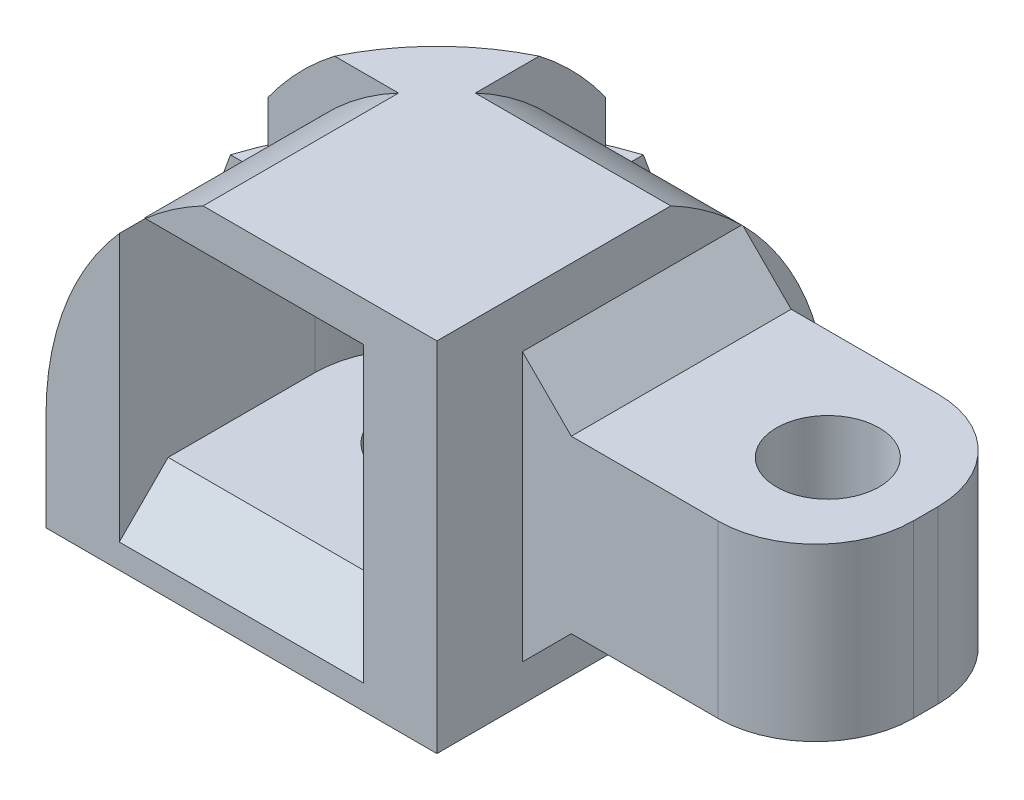
ISO-10303-21;
HEADER;
FILE_DESCRIPTION(('STEP AP214'),'2;1');
FILE_NAME('part.step','',(''),(''),'','','');
FILE_SCHEMA(('AUTOMOTIVE_DESIGN { 1 0 10303 214 1 1 1 1 }'));
ENDSEC;
DATA;
#1=APPLICATION_CONTEXT('core data for automotive mechanical design processes');
#2=APPLICATION_PROTOCOL_DEFINITION('international standard','automotive_design',2000,#1);
#3=PRODUCT_CONTEXT('',#1,'mechanical');
#4=PRODUCT('Part','Part','',(#3));
#5=PRODUCT_RELATED_PRODUCT_CATEGORY('part','',(#4));
#6=PRODUCT_DEFINITION_FORMATION('','',#4);
#7=PRODUCT_DEFINITION_CONTEXT('part definition',#1,'design');
#8=PRODUCT_DEFINITION('design','',#6,#7);
#9=PRODUCT_DEFINITION_SHAPE('','',#8);
#10=(LENGTH_UNIT() NAMED_UNIT(*) SI_UNIT(.MILLI.,.METRE.));
#11=(NAMED_UNIT(*) PLANE_ANGLE_UNIT() SI_UNIT($,.RADIAN.));
#12=(NAMED_UNIT(*) SI_UNIT($,.STERADIAN.) SOLID_ANGLE_UNIT());
#13=UNCERTAINTY_MEASURE_WITH_UNIT(LENGTH_MEASURE(1.E-05),#10,'distance_accuracy_value','');
#14=(GEOMETRIC_REPRESENTATION_CONTEXT(3) GLOBAL_UNCERTAINTY_ASSIGNED_CONTEXT((#13)) GLOBAL_UNIT_ASSIGNED_CONTEXT((#10,
#11,#12)) REPRESENTATION_CONTEXT('',''));
#15=CARTESIAN_POINT('',(0.,0.,0.));
#16=DIRECTION('',(0.,0.,1.));
#17=DIRECTION('',(1.,0.,0.));
#18=AXIS2_PLACEMENT_3D('',#15,#16,#17);
#19=CARTESIAN_POINT('',(0.,0.,0.));
#20=DIRECTION('',(0.,-1.,0.));
#21=DIRECTION('',(-1.,0.,0.));
#22=AXIS2_PLACEMENT_3D('',#19,#20,#21);
#23=SPHERICAL_SURFACE('',#22,7.);
#24=CARTESIAN_POINT('',(0.,0.,-2.));
#25=DIRECTION('',(0.,0.,1.));
#26=DIRECTION('',(1.,0.,0.));
#27=AXIS2_PLACEMENT_3D('',#24,#25,#26);
#28=CIRCLE('',#27,6.70820393249937);
#29=CARTESIAN_POINT('',(-6.40312423743285,-2.,-2.));
#30=VERTEX_POINT('',#29);
#31=CARTESIAN_POINT('',(-6.22494979899437,2.5,-2.));
#32=VERTEX_POINT('',#31);
#33=EDGE_CURVE('E251',#30,#32,#28,.F.);
#34=ORIENTED_EDGE('',*,*,#33,.T.);
#35=CARTESIAN_POINT('',(0.,2.5,0.));
#36=DIRECTION('',(0.,-1.,0.));
#37=DIRECTION('',(0.,0.,1.));
#38=AXIS2_PLACEMENT_3D('',#35,#36,#37);
#39=CIRCLE('',#38,6.53834841531101);
#40=CARTESIAN_POINT('',(-2.,2.5,-6.22494979899437));
#41=VERTEX_POINT('',#40);
#42=EDGE_CURVE('E55',#32,#41,#39,.T.);
#43=ORIENTED_EDGE('',*,*,#42,.T.);
#44=CARTESIAN_POINT('',(-2.,0.,0.));
#45=DIRECTION('',(1.,0.,0.));
#46=DIRECTION('',(0.,0.,-1.));
#47=AXIS2_PLACEMENT_3D('',#44,#45,#46);
#48=CIRCLE('',#47,6.70820393249937);
#49=CARTESIAN_POINT('',(-2.,-2.,-6.40312423743285));
#50=VERTEX_POINT('',#49);
#51=EDGE_CURVE('E249',#41,#50,#48,.F.);
#52=ORIENTED_EDGE('',*,*,#51,.T.);
#53=CARTESIAN_POINT('',(0.,-2.,0.));
#54=DIRECTION('',(0.,-1.,0.));
#55=DIRECTION('',(0.,0.,-1.));
#56=AXIS2_PLACEMENT_3D('',#53,#54,#55);
#57=CIRCLE('',#56,6.70820393249937);
#58=EDGE_CURVE('E540',#50,#30,#57,.F.);
#59=ORIENTED_EDGE('',*,*,#58,.T.);
#60=EDGE_LOOP('',(#34,#43,#52,#59));
#61=FACE_BOUND('',#60,.T.);
#62=ADVANCED_FACE('F39',(#61),#23,.T.);
#63=CARTESIAN_POINT('',(-2.,0.,0.));
#64=DIRECTION('',(1.,0.,0.));
#65=DIRECTION('',(0.,0.,-1.));
#66=AXIS2_PLACEMENT_3D('',#63,#64,#65);
#67=PLANE('',#66);
#68=ORIENTED_EDGE('',*,*,#51,.F.);
#69=DIRECTION('',(0.,0.,1.));
#70=VECTOR('',#69,1.);
#71=CARTESIAN_POINT('',(-2.,2.5,-6.22494979899437));
#72=LINE('',#71,#70);
#73=CARTESIAN_POINT('',(-2.,2.5,-5.45435605731786));
#74=VERTEX_POINT('',#73);
#75=EDGE_CURVE('E238',#41,#74,#72,.T.);
#76=ORIENTED_EDGE('',*,*,#75,.T.);
#77=CARTESIAN_POINT('',(-2.,0.,0.));
#78=DIRECTION('',(-1.,0.,0.));
#79=DIRECTION('',(0.,0.,-1.));
#80=AXIS2_PLACEMENT_3D('',#77,#78,#79);
#81=CIRCLE('',#80,6.);
#82=CARTESIAN_POINT('',(-2.,0.,-6.));
#83=VERTEX_POINT('',#82);
#84=EDGE_CURVE('E459',#74,#83,#81,.T.);
#85=ORIENTED_EDGE('',*,*,#84,.T.);
#86=DIRECTION('',(0.,-1.,0.));
#87=VECTOR('',#86,1.);
#88=CARTESIAN_POINT('',(-2.,-2.,-6.));
#89=LINE('',#88,#87);
#90=CARTESIAN_POINT('',(-2.,-2.,-6.));
#91=VERTEX_POINT('',#90);
#92=EDGE_CURVE('E473',#83,#91,#89,.T.);
#93=ORIENTED_EDGE('',*,*,#92,.T.);
#94=DIRECTION('',(0.,0.,-1.));
#95=VECTOR('',#94,1.);
#96=CARTESIAN_POINT('',(-2.,-2.,-7.));
#97=LINE('',#96,#95);
#98=EDGE_CURVE('E257',#91,#50,#97,.T.);
#99=ORIENTED_EDGE('',*,*,#98,.T.);
#100=EDGE_LOOP('',(#68,#76,#85,#93,#99));
#101=FACE_BOUND('',#100,.T.);
#102=ADVANCED_FACE('F255',(#101),#67,.T.);
#103=CARTESIAN_POINT('',(0.,0.,-2.));
#104=DIRECTION('',(0.,0.,1.));
#105=DIRECTION('',(-1.,0.,0.));
#106=AXIS2_PLACEMENT_3D('',#103,#104,#105);
#107=PLANE('',#106);
#108=CARTESIAN_POINT('',(0.,0.,-2.));
#109=DIRECTION('',(0.,0.,1.));
#110=DIRECTION('',(-1.,0.,0.));
#111=AXIS2_PLACEMENT_3D('',#108,#109,#110);
#112=CIRCLE('',#111,6.);
#113=CARTESIAN_POINT('',(-5.45435605731786,2.5,-2.));
#114=VERTEX_POINT('',#113);
#115=CARTESIAN_POINT('',(-6.,0.,-2.));
#116=VERTEX_POINT('',#115);
#117=EDGE_CURVE('E439',#114,#116,#112,.T.);
#118=ORIENTED_EDGE('',*,*,#117,.F.);
#119=DIRECTION('',(-1.,0.,0.));
#120=VECTOR('',#119,1.);
#121=CARTESIAN_POINT('',(-5.45435605731786,2.5,-2.));
#122=LINE('',#121,#120);
#123=EDGE_CURVE('E597',#114,#32,#122,.T.);
#124=ORIENTED_EDGE('',*,*,#123,.T.);
#125=ORIENTED_EDGE('',*,*,#33,.F.);
#126=DIRECTION('',(-1.,0.,0.));
#127=VECTOR('',#126,1.);
#128=CARTESIAN_POINT('',(-7.,-2.,-2.));
#129=LINE('',#128,#127);
#130=CARTESIAN_POINT('',(-6.,-2.,-2.));
#131=VERTEX_POINT('',#130);
#132=EDGE_CURVE('E501',#131,#30,#129,.T.);
#133=ORIENTED_EDGE('',*,*,#132,.F.);
#134=DIRECTION('',(0.,-1.,0.));
#135=VECTOR('',#134,1.);
#136=CARTESIAN_POINT('',(-6.,-2.,-2.));
#137=LINE('',#136,#135);
#138=EDGE_CURVE('E446',#116,#131,#137,.T.);
#139=ORIENTED_EDGE('',*,*,#138,.F.);
#140=EDGE_LOOP('',(#118,#124,#125,#133,#139));
#141=FACE_BOUND('',#140,.T.);
#142=ADVANCED_FACE('F605',(#141),#107,.T.);
#143=CARTESIAN_POINT('',(2.,0.,0.));
#144=DIRECTION('',(1.,0.,0.));
#145=DIRECTION('',(0.,0.,-1.));
#146=AXIS2_PLACEMENT_3D('',#143,#144,#145);
#147=PLANE('',#146);
#148=DIRECTION('',(0.,0.,-1.));
#149=VECTOR('',#148,1.);
#150=CARTESIAN_POINT('',(2.,5.31428571428571,2.));
#151=LINE('',#150,#149);
#152=CARTESIAN_POINT('',(2.,5.31428571428571,2.));
#153=VERTEX_POINT('',#152);
#154=CARTESIAN_POINT('',(2.,5.31428571428571,-2.78538459587519));
#155=VERTEX_POINT('',#154);
#156=EDGE_CURVE('E588',#153,#155,#151,.T.);
#157=ORIENTED_EDGE('',*,*,#156,.F.);
#158=DIRECTION('',(0.,-1.,0.));
#159=VECTOR('',#158,1.);
#160=CARTESIAN_POINT('',(2.,-2.,2.));
#161=LINE('',#160,#159);
#162=CARTESIAN_POINT('',(2.,-2.,2.));
#163=VERTEX_POINT('',#162);
#164=EDGE_CURVE('E265',#153,#163,#161,.T.);
#165=ORIENTED_EDGE('',*,*,#164,.T.);
#166=DIRECTION('',(0.,0.,-1.));
#167=VECTOR('',#166,1.);
#168=CARTESIAN_POINT('',(2.,-2.,-7.));
#169=LINE('',#168,#167);
#170=CARTESIAN_POINT('',(2.,-2.,-6.));
#171=VERTEX_POINT('',#170);
#172=EDGE_CURVE('E272',#163,#171,#169,.T.);
#173=ORIENTED_EDGE('',*,*,#172,.T.);
#174=DIRECTION('',(0.,-1.,0.));
#175=VECTOR('',#174,1.);
#176=CARTESIAN_POINT('',(2.,-2.,-6.));
#177=LINE('',#176,#175);
#178=CARTESIAN_POINT('',(2.,0.,-6.));
#179=VERTEX_POINT('',#178);
#180=EDGE_CURVE('E464',#179,#171,#177,.T.);
#181=ORIENTED_EDGE('',*,*,#180,.F.);
#182=CARTESIAN_POINT('',(2.,0.,0.));
#183=DIRECTION('',(-1.,0.,0.));
#184=DIRECTION('',(0.,0.,-1.));
#185=AXIS2_PLACEMENT_3D('',#182,#183,#184);
#186=CIRCLE('',#185,6.);
#187=CARTESIAN_POINT('',(2.,4.23526858652436,-4.25));
#188=VERTEX_POINT('',#187);
#189=EDGE_CURVE('E465',#188,#179,#186,.T.);
#190=ORIENTED_EDGE('',*,*,#189,.F.);
#191=DIRECTION('',(0.,1.,0.));
#192=VECTOR('',#191,1.);
#193=CARTESIAN_POINT('',(2.,-0.25,-4.25));
#194=LINE('',#193,#192);
#195=CARTESIAN_POINT('',(2.,-1.25,-4.25));
#196=VERTEX_POINT('',#195);
#197=EDGE_CURVE('E557',#196,#188,#194,.T.);
#198=ORIENTED_EDGE('',*,*,#197,.F.);
#199=DIRECTION('',(0.,0.,1.));
#200=VECTOR('',#199,1.);
#201=CARTESIAN_POINT('',(2.,-1.25,0.));
#202=LINE('',#201,#200);
#203=CARTESIAN_POINT('',(2.,-1.25,0.25));
#204=VERTEX_POINT('',#203);
#205=EDGE_CURVE('E313',#196,#204,#202,.T.);
#206=ORIENTED_EDGE('',*,*,#205,.T.);
#207=DIRECTION('',(0.,-1.,0.));
#208=VECTOR('',#207,1.);
#209=CARTESIAN_POINT('',(2.,-0.250000000000001,0.25));
#210=LINE('',#209,#208);
#211=CARTESIAN_POINT('',(2.,4.24999999999999,0.25));
#212=VERTEX_POINT('',#211);
#213=EDGE_CURVE('E561',#212,#204,#210,.T.);
#214=ORIENTED_EDGE('',*,*,#213,.F.);
#215=DIRECTION('',(0.,0.,-1.));
#216=VECTOR('',#215,1.);
#217=CARTESIAN_POINT('',(2.,4.24999999999999,0.));
#218=LINE('',#217,#216);
#219=CARTESIAN_POINT('',(2.,4.25,-4.23526858652436));
#220=VERTEX_POINT('',#219);
#221=EDGE_CURVE('E317',#212,#220,#218,.T.);
#222=ORIENTED_EDGE('',*,*,#221,.T.);
#223=EDGE_CURVE('E460',#155,#220,#186,.T.);
#224=ORIENTED_EDGE('',*,*,#223,.F.);
#225=EDGE_LOOP('',(#157,#165,#173,#181,#190,#198,#206,#214,#222,#224));
#226=FACE_BOUND('',#225,.T.);
#227=ADVANCED_FACE('F617',(#226),#147,.T.);
#228=CARTESIAN_POINT('',(0.,-2.,0.));
#229=DIRECTION('',(0.,-1.,0.));
#230=DIRECTION('',(0.,0.,-1.));
#231=AXIS2_PLACEMENT_3D('',#228,#229,#230);
#232=PLANE('',#231);
#233=CARTESIAN_POINT('',(-2.,-2.,-2.));
#234=DIRECTION('',(0.,-1.,0.));
#235=DIRECTION('',(0.,0.,-1.));
#236=AXIS2_PLACEMENT_3D('',#233,#234,#235);
#237=CIRCLE('',#236,1.1);
#238=CARTESIAN_POINT('',(-2.,-2.,-3.1));
#239=VERTEX_POINT('',#238);
#240=EDGE_CURVE('E286',#239,#239,#237,.T.);
#241=ORIENTED_EDGE('',*,*,#240,.F.);
#242=EDGE_LOOP('',(#241));
#243=FACE_BOUND('',#242,.T.);
#244=ORIENTED_EDGE('',*,*,#58,.F.);
#245=ORIENTED_EDGE('',*,*,#98,.F.);
#246=DIRECTION('',(-1.,0.,0.));
#247=VECTOR('',#246,1.);
#248=CARTESIAN_POINT('',(2.,-2.,-6.));
#249=LINE('',#248,#247);
#250=EDGE_CURVE('E468',#171,#91,#249,.T.);
#251=ORIENTED_EDGE('',*,*,#250,.F.);
#252=ORIENTED_EDGE('',*,*,#172,.F.);
#253=DIRECTION('',(1.,0.,0.));
#254=VECTOR('',#253,1.);
#255=CARTESIAN_POINT('',(-7.,-2.,2.));
#256=LINE('',#255,#254);
#257=CARTESIAN_POINT('',(-6.,-2.,2.));
#258=VERTEX_POINT('',#257);
#259=EDGE_CURVE('E276',#258,#163,#256,.T.);
#260=ORIENTED_EDGE('',*,*,#259,.F.);
#261=DIRECTION('',(0.,0.,-1.));
#262=VECTOR('',#261,1.);
#263=CARTESIAN_POINT('',(-6.,-2.,2.));
#264=LINE('',#263,#262);
#265=EDGE_CURVE('E453',#258,#131,#264,.T.);
#266=ORIENTED_EDGE('',*,*,#265,.T.);
#267=ORIENTED_EDGE('',*,*,#132,.T.);
#268=EDGE_LOOP('',(#244,#245,#251,#252,#260,#266,#267));
#269=FACE_BOUND('',#268,.T.);
#270=ADVANCED_FACE('F614',(#243,#269),#232,.T.);
#271=CARTESIAN_POINT('',(0.,0.,2.));
#272=DIRECTION('',(0.,0.,1.));
#273=DIRECTION('',(1.,0.,0.));
#274=AXIS2_PLACEMENT_3D('',#271,#272,#273);
#275=PLANE('',#274);
#276=DIRECTION('',(1.,0.,0.));
#277=VECTOR('',#276,1.);
#278=CARTESIAN_POINT('',(-8.,5.31428571428571,2.));
#279=LINE('',#278,#277);
#280=CARTESIAN_POINT('',(-2.78538459587519,5.31428571428571,2.));
#281=VERTEX_POINT('',#280);
#282=EDGE_CURVE('E585',#281,#153,#279,.T.);
#283=ORIENTED_EDGE('',*,*,#282,.F.);
#284=CARTESIAN_POINT('',(0.,0.,2.));
#285=DIRECTION('',(0.,0.,1.));
#286=DIRECTION('',(-1.,0.,0.));
#287=AXIS2_PLACEMENT_3D('',#284,#285,#286);
#288=CIRCLE('',#287,6.);
#289=CARTESIAN_POINT('',(-3.96862696659688,4.5,2.));
#290=VERTEX_POINT('',#289);
#291=EDGE_CURVE('E430',#281,#290,#288,.T.);
#292=ORIENTED_EDGE('',*,*,#291,.T.);
#293=DIRECTION('',(1.,0.,0.));
#294=VECTOR('',#293,1.);
#295=CARTESIAN_POINT('',(0.5,4.5,2.));
#296=LINE('',#295,#294);
#297=CARTESIAN_POINT('',(0.5,4.5,2.));
#298=VERTEX_POINT('',#297);
#299=EDGE_CURVE('E294',#290,#298,#296,.T.);
#300=ORIENTED_EDGE('',*,*,#299,.T.);
#301=DIRECTION('',(0.,1.,0.));
#302=VECTOR('',#301,1.);
#303=CARTESIAN_POINT('',(0.5,-0.500000000000001,2.));
#304=LINE('',#303,#302);
#305=CARTESIAN_POINT('',(0.5,-1.50000000000001,2.));
#306=VERTEX_POINT('',#305);
#307=EDGE_CURVE('E538',#306,#298,#304,.T.);
#308=ORIENTED_EDGE('',*,*,#307,.F.);
#309=DIRECTION('',(-1.,0.,0.));
#310=VECTOR('',#309,1.);
#311=CARTESIAN_POINT('',(-4.5,-1.50000000000001,2.));
#312=LINE('',#311,#310);
#313=CARTESIAN_POINT('',(-4.5,-1.50000000000001,2.));
#314=VERTEX_POINT('',#313);
#315=EDGE_CURVE('E290',#306,#314,#312,.T.);
#316=ORIENTED_EDGE('',*,*,#315,.T.);
#317=DIRECTION('',(0.,-1.,0.));
#318=VECTOR('',#317,1.);
#319=CARTESIAN_POINT('',(-4.5,-0.500000000000002,2.));
#320=LINE('',#319,#318);
#321=CARTESIAN_POINT('',(-4.5,3.96862696659689,2.));
#322=VERTEX_POINT('',#321);
#323=EDGE_CURVE('E518',#322,#314,#320,.T.);
#324=ORIENTED_EDGE('',*,*,#323,.F.);
#325=CARTESIAN_POINT('',(-6.,0.,2.));
#326=VERTEX_POINT('',#325);
#327=EDGE_CURVE('E444',#322,#326,#288,.T.);
#328=ORIENTED_EDGE('',*,*,#327,.T.);
#329=DIRECTION('',(0.,-1.,0.));
#330=VECTOR('',#329,1.);
#331=CARTESIAN_POINT('',(-6.,-2.,2.));
#332=LINE('',#331,#330);
#333=EDGE_CURVE('E438',#326,#258,#332,.T.);
#334=ORIENTED_EDGE('',*,*,#333,.T.);
#335=ORIENTED_EDGE('',*,*,#259,.T.);
#336=ORIENTED_EDGE('',*,*,#164,.F.);
#337=EDGE_LOOP('',(#283,#292,#300,#308,#316,#324,#328,#334,#335,#336));
#338=FACE_BOUND('',#337,.T.);
#339=ADVANCED_FACE('F611',(#338),#275,.T.);
#340=CARTESIAN_POINT('',(0.,3.90512483795333,0.));
#341=DIRECTION('',(0.,-1.,0.));
#342=DIRECTION('',(0.,0.,-1.));
#343=AXIS2_PLACEMENT_3D('',#340,#341,#342);
#344=CIRCLE('',#343,5.80947501931113);
#345=CARTESIAN_POINT('',(-5.45435605731786,3.90512483795332,-2.));
#346=VERTEX_POINT('',#345);
#347=CARTESIAN_POINT('',(-2.,3.90512483795332,-5.45435605731786));
#348=VERTEX_POINT('',#347);
#349=EDGE_CURVE('E591',#346,#348,#344,.T.);
#350=ORIENTED_EDGE('',*,*,#349,.F.);
#351=CARTESIAN_POINT('',(-4.09369849243185,5.31428571428571,-2.));
#352=VERTEX_POINT('',#351);
#353=EDGE_CURVE('E63',#346,#352,#28,.F.);
#354=ORIENTED_EDGE('',*,*,#353,.T.);
#355=CARTESIAN_POINT('',(0.,5.31428571428571,0.));
#356=DIRECTION('',(0.,-1.,0.));
#357=DIRECTION('',(0.,0.,-1.));
#358=AXIS2_PLACEMENT_3D('',#355,#356,#357);
#359=CIRCLE('',#358,4.55613513264684);
#360=CARTESIAN_POINT('',(-2.,5.31428571428571,-4.09369849243185));
#361=VERTEX_POINT('',#360);
#362=EDGE_CURVE('E420',#361,#352,#359,.F.);
#363=ORIENTED_EDGE('',*,*,#362,.F.);
#364=EDGE_CURVE('E259',#361,#348,#48,.F.);
#365=ORIENTED_EDGE('',*,*,#364,.T.);
#366=EDGE_LOOP('',(#350,#354,#363,#365));
#367=FACE_BOUND('',#366,.T.);
#368=ADVANCED_FACE('F673',(#367),#23,.T.);
#369=CARTESIAN_POINT('',(2.,0.,0.));
#370=DIRECTION('',(-1.,0.,0.));
#371=DIRECTION('',(0.,0.,1.));
#372=AXIS2_PLACEMENT_3D('',#369,#370,#371);
#373=CYLINDRICAL_SURFACE('',#372,6.);
#374=CARTESIAN_POINT('',(-2.,5.31428571428571,-2.78538459587519));
#375=VERTEX_POINT('',#374);
#376=EDGE_CURVE('E469',#375,#74,#81,.T.);
#377=ORIENTED_EDGE('',*,*,#376,.F.);
#378=DIRECTION('',(-1.,0.,0.));
#379=VECTOR('',#378,1.);
#380=CARTESIAN_POINT('',(2.,5.31428571428571,-2.78538459587519));
#381=LINE('',#380,#379);
#382=EDGE_CURVE('E260',#155,#375,#381,.T.);
#383=ORIENTED_EDGE('',*,*,#382,.F.);
#384=ORIENTED_EDGE('',*,*,#223,.T.);
#385=CARTESIAN_POINT('',(6.25000000000005,0.,0.));
#386=DIRECTION('',(-0.707106781186543,-0.707106781186552,0.));
#387=DIRECTION('',(-0.707106781186552,0.707106781186543,0.));
#388=AXIS2_PLACEMENT_3D('',#385,#386,#387);
#389=ELLIPSE('',#388,8.48528137423862,6.);
#390=CARTESIAN_POINT('',(2.01473141347564,4.23526858652436,-4.25));
#391=VERTEX_POINT('',#390);
#392=EDGE_CURVE('E343',#220,#391,#389,.T.);
#393=ORIENTED_EDGE('',*,*,#392,.T.);
#394=DIRECTION('',(-1.,0.,0.));
#395=VECTOR('',#394,1.);
#396=CARTESIAN_POINT('',(2.01473141347564,4.23526858652436,-4.25));
#397=LINE('',#396,#395);
#398=EDGE_CURVE('E358',#188,#391,#397,.F.);
#399=ORIENTED_EDGE('',*,*,#398,.F.);
#400=ORIENTED_EDGE('',*,*,#189,.T.);
#401=DIRECTION('',(-1.,0.,0.));
#402=VECTOR('',#401,1.);
#403=CARTESIAN_POINT('',(2.,0.,-6.));
#404=LINE('',#403,#402);
#405=EDGE_CURVE('E266',#179,#83,#404,.T.);
#406=ORIENTED_EDGE('',*,*,#405,.T.);
#407=ORIENTED_EDGE('',*,*,#84,.F.);
#408=EDGE_LOOP('',(#377,#383,#384,#393,#399,#400,#406,#407));
#409=FACE_BOUND('',#408,.T.);
#410=ADVANCED_FACE('F486',(#409),#373,.T.);
#411=CARTESIAN_POINT('',(2.,-2.,-6.));
#412=DIRECTION('',(0.,0.,-1.));
#413=DIRECTION('',(-1.,0.,0.));
#414=AXIS2_PLACEMENT_3D('',#411,#412,#413);
#415=PLANE('',#414);
#416=ORIENTED_EDGE('',*,*,#92,.F.);
#417=ORIENTED_EDGE('',*,*,#405,.F.);
#418=ORIENTED_EDGE('',*,*,#180,.T.);
#419=ORIENTED_EDGE('',*,*,#250,.T.);
#420=EDGE_LOOP('',(#416,#417,#418,#419));
#421=FACE_BOUND('',#420,.T.);
#422=ADVANCED_FACE('F491',(#421),#415,.T.);
#423=DIRECTION('',(0.,-1.,0.));
#424=VECTOR('',#423,1.);
#425=CARTESIAN_POINT('',(-2.,4.,-5.45435605731786));
#426=LINE('',#425,#424);
#427=EDGE_CURVE('E594',#348,#74,#426,.T.);
#428=ORIENTED_EDGE('',*,*,#427,.F.);
#429=ORIENTED_EDGE('',*,*,#364,.F.);
#430=DIRECTION('',(0.,0.,-1.));
#431=VECTOR('',#430,1.);
#432=CARTESIAN_POINT('',(-2.,5.31428571428571,0.));
#433=LINE('',#432,#431);
#434=EDGE_CURVE('E580',#375,#361,#433,.T.);
#435=ORIENTED_EDGE('',*,*,#434,.F.);
#436=ORIENTED_EDGE('',*,*,#376,.T.);
#437=EDGE_LOOP('',(#428,#429,#435,#436));
#438=FACE_BOUND('',#437,.T.);
#439=ADVANCED_FACE('F678',(#438),#67,.T.);
#440=CARTESIAN_POINT('',(-6.,-2.,2.));
#441=DIRECTION('',(1.,0.,0.));
#442=DIRECTION('',(0.,0.,-1.));
#443=AXIS2_PLACEMENT_3D('',#440,#441,#442);
#444=PLANE('',#443);
#445=ORIENTED_EDGE('',*,*,#138,.T.);
#446=ORIENTED_EDGE('',*,*,#265,.F.);
#447=ORIENTED_EDGE('',*,*,#333,.F.);
#448=DIRECTION('',(0.,0.,-1.));
#449=VECTOR('',#448,1.);
#450=CARTESIAN_POINT('',(-6.,0.,2.));
#451=LINE('',#450,#449);
#452=EDGE_CURVE('E432',#326,#116,#451,.T.);
#453=ORIENTED_EDGE('',*,*,#452,.T.);
#454=EDGE_LOOP('',(#445,#446,#447,#453));
#455=FACE_BOUND('',#454,.T.);
#456=ADVANCED_FACE('F609',(#455),#444,.F.);
#457=CARTESIAN_POINT('',(0.,0.,2.));
#458=DIRECTION('',(0.,0.,-1.));
#459=DIRECTION('',(-1.,0.,0.));
#460=AXIS2_PLACEMENT_3D('',#457,#458,#459);
#461=CYLINDRICAL_SURFACE('',#460,6.);
#462=ORIENTED_EDGE('',*,*,#327,.F.);
#463=DIRECTION('',(0.,0.,-1.));
#464=VECTOR('',#463,1.);
#465=CARTESIAN_POINT('',(-4.5,3.96862696659689,2.));
#466=LINE('',#465,#464);
#467=CARTESIAN_POINT('',(-4.5,3.96862696659689,1.46862696659689));
#468=VERTEX_POINT('',#467);
#469=EDGE_CURVE('E301',#322,#468,#466,.T.);
#470=ORIENTED_EDGE('',*,*,#469,.T.);
#471=CARTESIAN_POINT('',(0.,0.,-2.49999999999999));
#472=DIRECTION('',(0.,-0.707106781186546,0.707106781186549));
#473=DIRECTION('',(0.,-0.707106781186549,-0.707106781186546));
#474=AXIS2_PLACEMENT_3D('',#471,#472,#473);
#475=ELLIPSE('',#474,8.48528137423856,6.);
#476=EDGE_CURVE('E298',#468,#290,#475,.F.);
#477=ORIENTED_EDGE('',*,*,#476,.T.);
#478=ORIENTED_EDGE('',*,*,#291,.F.);
#479=DIRECTION('',(0.,0.,-1.));
#480=VECTOR('',#479,1.);
#481=CARTESIAN_POINT('',(-2.78538459587519,5.31428571428571,2.));
#482=LINE('',#481,#480);
#483=CARTESIAN_POINT('',(-2.78538459587519,5.31428571428571,-2.));
#484=VERTEX_POINT('',#483);
#485=EDGE_CURVE('E418',#281,#484,#482,.T.);
#486=ORIENTED_EDGE('',*,*,#485,.T.);
#487=EDGE_CURVE('E428',#484,#114,#112,.T.);
#488=ORIENTED_EDGE('',*,*,#487,.T.);
#489=ORIENTED_EDGE('',*,*,#117,.T.);
#490=ORIENTED_EDGE('',*,*,#452,.F.);
#491=EDGE_LOOP('',(#462,#470,#477,#478,#486,#488,#489,#490));
#492=FACE_BOUND('',#491,.T.);
#493=ADVANCED_FACE('F427',(#492),#461,.T.);
#494=DIRECTION('',(0.,-1.,0.));
#495=VECTOR('',#494,1.);
#496=CARTESIAN_POINT('',(-5.45435605731786,4.,-2.));
#497=LINE('',#496,#495);
#498=EDGE_CURVE('E11',#114,#346,#497,.F.);
#499=ORIENTED_EDGE('',*,*,#498,.F.);
#500=ORIENTED_EDGE('',*,*,#487,.F.);
#501=DIRECTION('',(1.,0.,0.));
#502=VECTOR('',#501,1.);
#503=CARTESIAN_POINT('',(0.,5.31428571428571,-2.));
#504=LINE('',#503,#502);
#505=EDGE_CURVE('E48',#352,#484,#504,.T.);
#506=ORIENTED_EDGE('',*,*,#505,.F.);
#507=ORIENTED_EDGE('',*,*,#353,.F.);
#508=EDGE_LOOP('',(#499,#500,#506,#507));
#509=FACE_BOUND('',#508,.T.);
#510=ADVANCED_FACE('F435',(#509),#107,.T.);
#511=CARTESIAN_POINT('',(0.5,-0.500000000000001,-4.));
#512=DIRECTION('',(1.,0.,0.));
#513=DIRECTION('',(0.,1.,0.));
#514=AXIS2_PLACEMENT_3D('',#511,#512,#513);
#515=PLANE('',#514);
#516=DIRECTION('',(0.,0.,1.));
#517=VECTOR('',#516,1.);
#518=CARTESIAN_POINT('',(0.5,3.5,-4.));
#519=LINE('',#518,#517);
#520=CARTESIAN_POINT('',(0.5,3.5,-2.));
#521=VERTEX_POINT('',#520);
#522=CARTESIAN_POINT('',(0.5,3.5,0.999999999999999));
#523=VERTEX_POINT('',#522);
#524=EDGE_CURVE('E522',#521,#523,#519,.T.);
#525=ORIENTED_EDGE('',*,*,#524,.F.);
#526=DIRECTION('',(0.,1.,0.));
#527=VECTOR('',#526,1.);
#528=CARTESIAN_POINT('',(0.5,-0.500000000000001,-2.));
#529=LINE('',#528,#527);
#530=CARTESIAN_POINT('',(0.5,-0.500000000000001,-2.));
#531=VERTEX_POINT('',#530);
#532=EDGE_CURVE('E411',#521,#531,#529,.F.);
#533=ORIENTED_EDGE('',*,*,#532,.T.);
#534=DIRECTION('',(0.,0.,1.));
#535=VECTOR('',#534,1.);
#536=CARTESIAN_POINT('',(0.5,-0.500000000000001,-4.));
#537=LINE('',#536,#535);
#538=CARTESIAN_POINT('',(0.5,-0.500000000000001,0.999999999999999));
#539=VERTEX_POINT('',#538);
#540=EDGE_CURVE('E504',#531,#539,#537,.T.);
#541=ORIENTED_EDGE('',*,*,#540,.T.);
#542=DIRECTION('',(0.,-0.707106781186549,0.707106781186546));
#543=VECTOR('',#542,1.);
#544=CARTESIAN_POINT('',(0.5,2.,-1.49999999999999));
#545=LINE('',#544,#543);
#546=EDGE_CURVE('E331',#539,#306,#545,.T.);
#547=ORIENTED_EDGE('',*,*,#546,.T.);
#548=ORIENTED_EDGE('',*,*,#307,.T.);
#549=DIRECTION('',(0.,-0.707106781186549,-0.707106781186546));
#550=VECTOR('',#549,1.);
#551=CARTESIAN_POINT('',(0.5,-1.00000000000001,-3.49999999999999));
#552=LINE('',#551,#550);
#553=EDGE_CURVE('E327',#298,#523,#552,.T.);
#554=ORIENTED_EDGE('',*,*,#553,.T.);
#555=EDGE_LOOP('',(#525,#533,#541,#547,#548,#554));
#556=FACE_BOUND('',#555,.T.);
#557=ADVANCED_FACE('F709',(#556),#515,.F.);
#558=CARTESIAN_POINT('',(0.5,-0.500000000000001,-4.));
#559=DIRECTION('',(0.,-1.,0.));
#560=DIRECTION('',(1.,0.,0.));
#561=AXIS2_PLACEMENT_3D('',#558,#559,#560);
#562=PLANE('',#561);
#563=CARTESIAN_POINT('',(-2.,-0.5,-2.));
#564=DIRECTION('',(0.,-1.,0.));
#565=DIRECTION('',(1.,0.,0.));
#566=AXIS2_PLACEMENT_3D('',#563,#564,#565);
#567=CIRCLE('',#566,1.1);
#568=CARTESIAN_POINT('',(-0.9,-0.5,-2.));
#569=VERTEX_POINT('',#568);
#570=EDGE_CURVE('E564',#569,#569,#567,.T.);
#571=ORIENTED_EDGE('',*,*,#570,.T.);
#572=EDGE_LOOP('',(#571));
#573=FACE_BOUND('',#572,.T.);
#574=DIRECTION('',(1.,0.,0.));
#575=VECTOR('',#574,1.);
#576=CARTESIAN_POINT('',(0.5,-0.500000000000001,-4.));
#577=LINE('',#576,#575);
#578=CARTESIAN_POINT('',(-2.5,-0.500000000000001,-4.));
#579=VERTEX_POINT('',#578);
#580=CARTESIAN_POINT('',(-1.5,-0.500000000000001,-4.));
#581=VERTEX_POINT('',#580);
#582=EDGE_CURVE('E524',#579,#581,#577,.T.);
#583=ORIENTED_EDGE('',*,*,#582,.F.);
#584=CARTESIAN_POINT('',(-2.5,-0.500000000000001,-2.));
#585=DIRECTION('',(0.,-1.,0.));
#586=DIRECTION('',(1.,0.,0.));
#587=AXIS2_PLACEMENT_3D('',#584,#585,#586);
#588=CIRCLE('',#587,2.);
#589=CARTESIAN_POINT('',(-4.5,-0.500000000000002,-2.));
#590=VERTEX_POINT('',#589);
#591=EDGE_CURVE('E399',#579,#590,#588,.F.);
#592=ORIENTED_EDGE('',*,*,#591,.T.);
#593=DIRECTION('',(0.,0.,1.));
#594=VECTOR('',#593,1.);
#595=CARTESIAN_POINT('',(-4.5,-0.500000000000002,-4.));
#596=LINE('',#595,#594);
#597=CARTESIAN_POINT('',(-4.5,-0.500000000000002,0.999999999999999));
#598=VERTEX_POINT('',#597);
#599=EDGE_CURVE('E509',#590,#598,#596,.T.);
#600=ORIENTED_EDGE('',*,*,#599,.T.);
#601=DIRECTION('',(1.,0.,0.));
#602=VECTOR('',#601,1.);
#603=CARTESIAN_POINT('',(0.5,-0.500000000000001,0.999999999999999));
#604=LINE('',#603,#602);
#605=EDGE_CURVE('E305',#598,#539,#604,.T.);
#606=ORIENTED_EDGE('',*,*,#605,.T.);
#607=ORIENTED_EDGE('',*,*,#540,.F.);
#608=CARTESIAN_POINT('',(-1.5,-0.500000000000001,-2.));
#609=DIRECTION('',(0.,-1.,0.));
#610=DIRECTION('',(1.,0.,0.));
#611=AXIS2_PLACEMENT_3D('',#608,#609,#610);
#612=CIRCLE('',#611,2.);
#613=EDGE_CURVE('E396',#531,#581,#612,.F.);
#614=ORIENTED_EDGE('',*,*,#613,.T.);
#615=EDGE_LOOP('',(#583,#592,#600,#606,#607,#614));
#616=FACE_BOUND('',#615,.T.);
#617=ADVANCED_FACE('F714',(#573,#616),#562,.F.);
#618=CARTESIAN_POINT('',(-4.5,-0.500000000000002,-4.));
#619=DIRECTION('',(-1.,0.,0.));
#620=DIRECTION('',(0.,0.,1.));
#621=AXIS2_PLACEMENT_3D('',#618,#619,#620);
#622=PLANE('',#621);
#623=ORIENTED_EDGE('',*,*,#599,.F.);
#624=DIRECTION('',(0.,-1.,0.));
#625=VECTOR('',#624,1.);
#626=CARTESIAN_POINT('',(-4.5,-0.500000000000002,-2.));
#627=LINE('',#626,#625);
#628=CARTESIAN_POINT('',(-4.5,3.5,-2.));
#629=VERTEX_POINT('',#628);
#630=EDGE_CURVE('E402',#590,#629,#627,.F.);
#631=ORIENTED_EDGE('',*,*,#630,.T.);
#632=DIRECTION('',(0.,0.,1.));
#633=VECTOR('',#632,1.);
#634=CARTESIAN_POINT('',(-4.5,3.5,-4.));
#635=LINE('',#634,#633);
#636=CARTESIAN_POINT('',(-4.5,3.5,0.999999999999999));
#637=VERTEX_POINT('',#636);
#638=EDGE_CURVE('E515',#629,#637,#635,.T.);
#639=ORIENTED_EDGE('',*,*,#638,.T.);
#640=DIRECTION('',(0.,0.707106781186549,0.707106781186546));
#641=VECTOR('',#640,1.);
#642=CARTESIAN_POINT('',(-4.5,-1.00000000000001,-3.49999999999999));
#643=LINE('',#642,#641);
#644=EDGE_CURVE('E324',#637,#468,#643,.T.);
#645=ORIENTED_EDGE('',*,*,#644,.T.);
#646=ORIENTED_EDGE('',*,*,#469,.F.);
#647=ORIENTED_EDGE('',*,*,#323,.T.);
#648=DIRECTION('',(0.,0.707106781186549,-0.707106781186546));
#649=VECTOR('',#648,1.);
#650=CARTESIAN_POINT('',(-4.5,2.,-1.49999999999999));
#651=LINE('',#650,#649);
#652=EDGE_CURVE('E335',#314,#598,#651,.T.);
#653=ORIENTED_EDGE('',*,*,#652,.T.);
#654=EDGE_LOOP('',(#623,#631,#639,#645,#646,#647,#653));
#655=FACE_BOUND('',#654,.T.);
#656=ADVANCED_FACE('F861',(#655),#622,.F.);
#657=CARTESIAN_POINT('',(0.5,3.5,-4.));
#658=DIRECTION('',(0.,1.,0.));
#659=DIRECTION('',(-1.,0.,0.));
#660=AXIS2_PLACEMENT_3D('',#657,#658,#659);
#661=PLANE('',#660);
#662=ORIENTED_EDGE('',*,*,#638,.F.);
#663=CARTESIAN_POINT('',(-2.5,3.5,-2.));
#664=DIRECTION('',(0.,1.,0.));
#665=DIRECTION('',(-1.,0.,0.));
#666=AXIS2_PLACEMENT_3D('',#663,#664,#665);
#667=CIRCLE('',#666,2.);
#668=CARTESIAN_POINT('',(-2.5,3.5,-4.));
#669=VERTEX_POINT('',#668);
#670=EDGE_CURVE('E408',#629,#669,#667,.F.);
#671=ORIENTED_EDGE('',*,*,#670,.T.);
#672=DIRECTION('',(-1.,0.,0.));
#673=VECTOR('',#672,1.);
#674=CARTESIAN_POINT('',(0.5,3.5,-4.));
#675=LINE('',#674,#673);
#676=CARTESIAN_POINT('',(-1.5,3.5,-4.));
#677=VERTEX_POINT('',#676);
#678=EDGE_CURVE('E529',#677,#669,#675,.T.);
#679=ORIENTED_EDGE('',*,*,#678,.F.);
#680=CARTESIAN_POINT('',(-1.5,3.5,-2.));
#681=DIRECTION('',(0.,1.,0.));
#682=DIRECTION('',(-1.,0.,0.));
#683=AXIS2_PLACEMENT_3D('',#680,#681,#682);
#684=CIRCLE('',#683,2.);
#685=EDGE_CURVE('E405',#677,#521,#684,.F.);
#686=ORIENTED_EDGE('',*,*,#685,.T.);
#687=ORIENTED_EDGE('',*,*,#524,.T.);
#688=DIRECTION('',(-1.,0.,0.));
#689=VECTOR('',#688,1.);
#690=CARTESIAN_POINT('',(-4.5,3.5,0.999999999999999));
#691=LINE('',#690,#689);
#692=EDGE_CURVE('E280',#523,#637,#691,.T.);
#693=ORIENTED_EDGE('',*,*,#692,.T.);
#694=EDGE_LOOP('',(#662,#671,#679,#686,#687,#693));
#695=FACE_BOUND('',#694,.T.);
#696=ADVANCED_FACE('F871',(#695),#661,.F.);
#697=CARTESIAN_POINT('',(0.,0.,-4.));
#698=DIRECTION('',(0.,0.,1.));
#699=DIRECTION('',(1.,0.,0.));
#700=AXIS2_PLACEMENT_3D('',#697,#698,#699);
#701=PLANE('',#700);
#702=ORIENTED_EDGE('',*,*,#678,.T.);
#703=DIRECTION('',(0.,-1.,0.));
#704=VECTOR('',#703,1.);
#705=CARTESIAN_POINT('',(-2.5,0.,-4.));
#706=LINE('',#705,#704);
#707=EDGE_CURVE('E392',#669,#579,#706,.T.);
#708=ORIENTED_EDGE('',*,*,#707,.T.);
#709=ORIENTED_EDGE('',*,*,#582,.T.);
#710=DIRECTION('',(0.,1.,0.));
#711=VECTOR('',#710,1.);
#712=CARTESIAN_POINT('',(-1.5,0.,-4.));
#713=LINE('',#712,#711);
#714=EDGE_CURVE('E388',#581,#677,#713,.T.);
#715=ORIENTED_EDGE('',*,*,#714,.T.);
#716=EDGE_LOOP('',(#702,#708,#709,#715));
#717=FACE_BOUND('',#716,.T.);
#718=ADVANCED_FACE('F801',(#717),#701,.T.);
#719=CARTESIAN_POINT('',(8.,-0.250000000000001,0.25));
#720=DIRECTION('',(0.,0.,-1.));
#721=DIRECTION('',(-1.,0.,0.));
#722=AXIS2_PLACEMENT_3D('',#719,#720,#721);
#723=PLANE('',#722);
#724=DIRECTION('',(-1.,0.,0.));
#725=VECTOR('',#724,1.);
#726=CARTESIAN_POINT('',(8.,-0.250000000000001,0.25));
#727=LINE('',#726,#725);
#728=CARTESIAN_POINT('',(6.,-0.250000000000001,0.25));
#729=VERTEX_POINT('',#728);
#730=CARTESIAN_POINT('',(3.00000000000001,-0.250000000000001,0.25));
#731=VERTEX_POINT('',#730);
#732=EDGE_CURVE('E543',#729,#731,#727,.T.);
#733=ORIENTED_EDGE('',*,*,#732,.F.);
#734=DIRECTION('',(0.,-1.,0.));
#735=VECTOR('',#734,1.);
#736=CARTESIAN_POINT('',(6.,-0.250000000000001,0.25));
#737=LINE('',#736,#735);
#738=CARTESIAN_POINT('',(6.,3.25,0.25));
#739=VERTEX_POINT('',#738);
#740=EDGE_CURVE('E376',#729,#739,#737,.F.);
#741=ORIENTED_EDGE('',*,*,#740,.T.);
#742=DIRECTION('',(-1.,0.,0.));
#743=VECTOR('',#742,1.);
#744=CARTESIAN_POINT('',(8.,3.25,0.25));
#745=LINE('',#744,#743);
#746=CARTESIAN_POINT('',(3.00000000000001,3.25,0.25));
#747=VERTEX_POINT('',#746);
#748=EDGE_CURVE('E553',#739,#747,#745,.T.);
#749=ORIENTED_EDGE('',*,*,#748,.T.);
#750=DIRECTION('',(-0.707106781186552,0.707106781186543,0.));
#751=VECTOR('',#750,1.);
#752=CARTESIAN_POINT('',(7.25000000000003,-0.999999999999976,0.25));
#753=LINE('',#752,#751);
#754=EDGE_CURVE('E339',#747,#212,#753,.T.);
#755=ORIENTED_EDGE('',*,*,#754,.T.);
#756=ORIENTED_EDGE('',*,*,#213,.T.);
#757=DIRECTION('',(0.707106781186552,0.707106781186543,0.));
#758=VECTOR('',#757,1.);
#759=CARTESIAN_POINT('',(5.50000000000003,2.25,0.25));
#760=LINE('',#759,#758);
#761=EDGE_CURVE('E354',#204,#731,#760,.T.);
#762=ORIENTED_EDGE('',*,*,#761,.T.);
#763=EDGE_LOOP('',(#733,#741,#749,#755,#756,#762));
#764=FACE_BOUND('',#763,.T.);
#765=ADVANCED_FACE('F641',(#764),#723,.F.);
#766=CARTESIAN_POINT('',(8.,-0.250000000000001,0.25));
#767=DIRECTION('',(0.,1.,0.));
#768=DIRECTION('',(0.,0.,1.));
#769=AXIS2_PLACEMENT_3D('',#766,#767,#768);
#770=PLANE('',#769);
#771=CARTESIAN_POINT('',(6.,-0.25,-2.));
#772=DIRECTION('',(0.,1.,0.));
#773=DIRECTION('',(0.,0.,1.));
#774=AXIS2_PLACEMENT_3D('',#771,#772,#773);
#775=CIRCLE('',#774,1.05);
#776=CARTESIAN_POINT('',(6.,-0.25,-0.95));
#777=VERTEX_POINT('',#776);
#778=EDGE_CURVE('E285',#777,#777,#775,.T.);
#779=ORIENTED_EDGE('',*,*,#778,.T.);
#780=EDGE_LOOP('',(#779));
#781=FACE_BOUND('',#780,.T.);
#782=DIRECTION('',(0.,0.,-1.));
#783=VECTOR('',#782,1.);
#784=CARTESIAN_POINT('',(8.,-0.250000000000001,0.25));
#785=LINE('',#784,#783);
#786=CARTESIAN_POINT('',(8.,-0.25,-1.75));
#787=VERTEX_POINT('',#786);
#788=CARTESIAN_POINT('',(8.,-0.25,-2.25));
#789=VERTEX_POINT('',#788);
#790=EDGE_CURVE('E560',#787,#789,#785,.T.);
#791=ORIENTED_EDGE('',*,*,#790,.F.);
#792=CARTESIAN_POINT('',(6.,-0.25,-1.75));
#793=DIRECTION('',(0.,1.,0.));
#794=DIRECTION('',(0.,0.,1.));
#795=AXIS2_PLACEMENT_3D('',#792,#793,#794);
#796=CIRCLE('',#795,2.);
#797=EDGE_CURVE('E373',#787,#729,#796,.F.);
#798=ORIENTED_EDGE('',*,*,#797,.T.);
#799=ORIENTED_EDGE('',*,*,#732,.T.);
#800=DIRECTION('',(0.,0.,-1.));
#801=VECTOR('',#800,1.);
#802=CARTESIAN_POINT('',(3.00000000000001,-0.250000000000001,0.25));
#803=LINE('',#802,#801);
#804=CARTESIAN_POINT('',(3.00000000000001,-0.25,-4.25));
#805=VERTEX_POINT('',#804);
#806=EDGE_CURVE('E320',#731,#805,#803,.T.);
#807=ORIENTED_EDGE('',*,*,#806,.T.);
#808=DIRECTION('',(-1.,0.,0.));
#809=VECTOR('',#808,1.);
#810=CARTESIAN_POINT('',(8.,-0.25,-4.25));
#811=LINE('',#810,#809);
#812=CARTESIAN_POINT('',(6.,-0.25,-4.25));
#813=VERTEX_POINT('',#812);
#814=EDGE_CURVE('E545',#813,#805,#811,.T.);
#815=ORIENTED_EDGE('',*,*,#814,.F.);
#816=CARTESIAN_POINT('',(6.,-0.25,-2.25));
#817=DIRECTION('',(0.,1.,0.));
#818=DIRECTION('',(0.,0.,1.));
#819=AXIS2_PLACEMENT_3D('',#816,#817,#818);
#820=CIRCLE('',#819,2.);
#821=EDGE_CURVE('E370',#813,#789,#820,.F.);
#822=ORIENTED_EDGE('',*,*,#821,.T.);
#823=EDGE_LOOP('',(#791,#798,#799,#807,#815,#822));
#824=FACE_BOUND('',#823,.T.);
#825=ADVANCED_FACE('F656',(#781,#824),#770,.F.);
#826=CARTESIAN_POINT('',(8.,-0.25,-4.25));
#827=DIRECTION('',(0.,0.,1.));
#828=DIRECTION('',(0.,-1.,0.));
#829=AXIS2_PLACEMENT_3D('',#826,#827,#828);
#830=PLANE('',#829);
#831=DIRECTION('',(-1.,0.,0.));
#832=VECTOR('',#831,1.);
#833=CARTESIAN_POINT('',(8.,3.25,-4.25));
#834=LINE('',#833,#832);
#835=CARTESIAN_POINT('',(6.,3.25,-4.25));
#836=VERTEX_POINT('',#835);
#837=CARTESIAN_POINT('',(3.00000000000001,3.25,-4.25));
#838=VERTEX_POINT('',#837);
#839=EDGE_CURVE('E550',#836,#838,#834,.T.);
#840=ORIENTED_EDGE('',*,*,#839,.F.);
#841=DIRECTION('',(0.,1.,0.));
#842=VECTOR('',#841,1.);
#843=CARTESIAN_POINT('',(6.,-0.25,-4.25));
#844=LINE('',#843,#842);
#845=EDGE_CURVE('E385',#836,#813,#844,.F.);
#846=ORIENTED_EDGE('',*,*,#845,.T.);
#847=ORIENTED_EDGE('',*,*,#814,.T.);
#848=DIRECTION('',(-0.707106781186552,-0.707106781186543,0.));
#849=VECTOR('',#848,1.);
#850=CARTESIAN_POINT('',(5.50000000000003,2.25,-4.25));
#851=LINE('',#850,#849);
#852=EDGE_CURVE('E350',#805,#196,#851,.T.);
#853=ORIENTED_EDGE('',*,*,#852,.T.);
#854=ORIENTED_EDGE('',*,*,#197,.T.);
#855=ORIENTED_EDGE('',*,*,#398,.T.);
#856=DIRECTION('',(0.707106781186552,-0.707106781186543,0.));
#857=VECTOR('',#856,1.);
#858=CARTESIAN_POINT('',(7.25000000000003,-0.999999999999975,-4.25));
#859=LINE('',#858,#857);
#860=EDGE_CURVE('E346',#391,#838,#859,.T.);
#861=ORIENTED_EDGE('',*,*,#860,.T.);
#862=EDGE_LOOP('',(#840,#846,#847,#853,#854,#855,#861));
#863=FACE_BOUND('',#862,.T.);
#864=ADVANCED_FACE('F631',(#863),#830,.F.);
#865=CARTESIAN_POINT('',(8.,3.25,0.25));
#866=DIRECTION('',(0.,-1.,0.));
#867=DIRECTION('',(0.,0.,-1.));
#868=AXIS2_PLACEMENT_3D('',#865,#866,#867);
#869=PLANE('',#868);
#870=CARTESIAN_POINT('',(6.,3.25,-2.));
#871=DIRECTION('',(0.,-1.,0.));
#872=DIRECTION('',(0.,0.,-1.));
#873=AXIS2_PLACEMENT_3D('',#870,#871,#872);
#874=CIRCLE('',#873,1.05);
#875=CARTESIAN_POINT('',(6.,3.25,-3.05));
#876=VERTEX_POINT('',#875);
#877=EDGE_CURVE('E281',#876,#876,#874,.T.);
#878=ORIENTED_EDGE('',*,*,#877,.T.);
#879=EDGE_LOOP('',(#878));
#880=FACE_BOUND('',#879,.T.);
#881=ORIENTED_EDGE('',*,*,#748,.F.);
#882=CARTESIAN_POINT('',(6.,3.25,-1.75));
#883=DIRECTION('',(0.,-1.,0.));
#884=DIRECTION('',(0.,0.,-1.));
#885=AXIS2_PLACEMENT_3D('',#882,#883,#884);
#886=CIRCLE('',#885,2.);
#887=CARTESIAN_POINT('',(8.,3.25,-1.75));
#888=VERTEX_POINT('',#887);
#889=EDGE_CURVE('E382',#739,#888,#886,.F.);
#890=ORIENTED_EDGE('',*,*,#889,.T.);
#891=DIRECTION('',(0.,0.,1.));
#892=VECTOR('',#891,1.);
#893=CARTESIAN_POINT('',(8.,3.25,0.25));
#894=LINE('',#893,#892);
#895=CARTESIAN_POINT('',(8.,3.25,-2.25));
#896=VERTEX_POINT('',#895);
#897=EDGE_CURVE('E556',#896,#888,#894,.T.);
#898=ORIENTED_EDGE('',*,*,#897,.F.);
#899=CARTESIAN_POINT('',(6.,3.25,-2.25));
#900=DIRECTION('',(0.,-1.,0.));
#901=DIRECTION('',(0.,0.,-1.));
#902=AXIS2_PLACEMENT_3D('',#899,#900,#901);
#903=CIRCLE('',#902,2.);
#904=EDGE_CURVE('E379',#896,#836,#903,.F.);
#905=ORIENTED_EDGE('',*,*,#904,.T.);
#906=ORIENTED_EDGE('',*,*,#839,.T.);
#907=DIRECTION('',(0.,0.,1.));
#908=VECTOR('',#907,1.);
#909=CARTESIAN_POINT('',(3.00000000000001,3.25,0.25));
#910=LINE('',#909,#908);
#911=EDGE_CURVE('E309',#838,#747,#910,.T.);
#912=ORIENTED_EDGE('',*,*,#911,.T.);
#913=EDGE_LOOP('',(#881,#890,#898,#905,#906,#912));
#914=FACE_BOUND('',#913,.T.);
#915=ADVANCED_FACE('F646',(#880,#914),#869,.F.);
#916=CARTESIAN_POINT('',(8.,0.,0.));
#917=DIRECTION('',(-1.,0.,0.));
#918=DIRECTION('',(0.,0.,1.));
#919=AXIS2_PLACEMENT_3D('',#916,#917,#918);
#920=PLANE('',#919);
#921=ORIENTED_EDGE('',*,*,#897,.T.);
#922=DIRECTION('',(0.,-1.,0.));
#923=VECTOR('',#922,1.);
#924=CARTESIAN_POINT('',(8.,0.,-1.75));
#925=LINE('',#924,#923);
#926=EDGE_CURVE('E366',#888,#787,#925,.T.);
#927=ORIENTED_EDGE('',*,*,#926,.T.);
#928=ORIENTED_EDGE('',*,*,#790,.T.);
#929=DIRECTION('',(0.,1.,0.));
#930=VECTOR('',#929,1.);
#931=CARTESIAN_POINT('',(8.,0.,-2.25));
#932=LINE('',#931,#930);
#933=EDGE_CURVE('E362',#789,#896,#932,.T.);
#934=ORIENTED_EDGE('',*,*,#933,.T.);
#935=EDGE_LOOP('',(#921,#927,#928,#934));
#936=FACE_BOUND('',#935,.T.);
#937=ADVANCED_FACE('F653',(#936),#920,.F.);
#938=CARTESIAN_POINT('',(6.,6.61126983722081,-2.));
#939=DIRECTION('',(0.,-1.,0.));
#940=DIRECTION('',(0.,0.,-1.));
#941=AXIS2_PLACEMENT_3D('',#938,#939,#940);
#942=CYLINDRICAL_SURFACE('',#941,1.05);
#943=ORIENTED_EDGE('',*,*,#877,.F.);
#944=EDGE_LOOP('',(#943));
#945=FACE_BOUND('',#944,.T.);
#946=ORIENTED_EDGE('',*,*,#778,.F.);
#947=EDGE_LOOP('',(#946));
#948=FACE_BOUND('',#947,.T.);
#949=ADVANCED_FACE('F738',(#945,#948),#942,.F.);
#950=CARTESIAN_POINT('',(-2.,6.61126983722081,-2.));
#951=DIRECTION('',(0.,-1.,0.));
#952=DIRECTION('',(0.,0.,-1.));
#953=AXIS2_PLACEMENT_3D('',#950,#951,#952);
#954=CYLINDRICAL_SURFACE('',#953,1.1);
#955=ORIENTED_EDGE('',*,*,#240,.T.);
#956=EDGE_LOOP('',(#955));
#957=FACE_BOUND('',#956,.T.);
#958=ORIENTED_EDGE('',*,*,#570,.F.);
#959=EDGE_LOOP('',(#958));
#960=FACE_BOUND('',#959,.T.);
#961=ADVANCED_FACE('F743',(#957,#960),#954,.F.);
#962=CARTESIAN_POINT('',(0.5,3.5,0.999999999999999));
#963=DIRECTION('',(0.,-0.707106781186546,0.707106781186549));
#964=DIRECTION('',(1.,0.,0.));
#965=AXIS2_PLACEMENT_3D('',#962,#963,#964);
#966=PLANE('',#965);
#967=ORIENTED_EDGE('',*,*,#299,.F.);
#968=ORIENTED_EDGE('',*,*,#476,.F.);
#969=ORIENTED_EDGE('',*,*,#644,.F.);
#970=ORIENTED_EDGE('',*,*,#692,.F.);
#971=ORIENTED_EDGE('',*,*,#553,.F.);
#972=EDGE_LOOP('',(#967,#968,#969,#970,#971));
#973=FACE_BOUND('',#972,.T.);
#974=ADVANCED_FACE('F755',(#973),#966,.T.);
#975=CARTESIAN_POINT('',(0.5,-0.500000000000001,0.999999999999999));
#976=DIRECTION('',(0.,0.707106781186546,0.707106781186549));
#977=DIRECTION('',(-1.,0.,0.));
#978=AXIS2_PLACEMENT_3D('',#975,#976,#977);
#979=PLANE('',#978);
#980=ORIENTED_EDGE('',*,*,#652,.F.);
#981=ORIENTED_EDGE('',*,*,#315,.F.);
#982=ORIENTED_EDGE('',*,*,#546,.F.);
#983=ORIENTED_EDGE('',*,*,#605,.F.);
#984=EDGE_LOOP('',(#980,#981,#982,#983));
#985=FACE_BOUND('',#984,.T.);
#986=ADVANCED_FACE('F765',(#985),#979,.T.);
#987=CARTESIAN_POINT('',(3.00000000000001,3.25,0.25));
#988=DIRECTION('',(-0.707106781186543,-0.707106781186552,0.));
#989=DIRECTION('',(0.,0.,1.));
#990=AXIS2_PLACEMENT_3D('',#987,#988,#989);
#991=PLANE('',#990);
#992=ORIENTED_EDGE('',*,*,#392,.F.);
#993=ORIENTED_EDGE('',*,*,#221,.F.);
#994=ORIENTED_EDGE('',*,*,#754,.F.);
#995=ORIENTED_EDGE('',*,*,#911,.F.);
#996=ORIENTED_EDGE('',*,*,#860,.F.);
#997=EDGE_LOOP('',(#992,#993,#994,#995,#996));
#998=FACE_BOUND('',#997,.T.);
#999=ADVANCED_FACE('F626',(#998),#991,.F.);
#1000=CARTESIAN_POINT('',(3.00000000000001,-0.250000000000001,0.25));
#1001=DIRECTION('',(-0.707106781186543,0.707106781186552,0.));
#1002=DIRECTION('',(0.,0.,-1.));
#1003=AXIS2_PLACEMENT_3D('',#1000,#1001,#1002);
#1004=PLANE('',#1003);
#1005=ORIENTED_EDGE('',*,*,#761,.F.);
#1006=ORIENTED_EDGE('',*,*,#205,.F.);
#1007=ORIENTED_EDGE('',*,*,#852,.F.);
#1008=ORIENTED_EDGE('',*,*,#806,.F.);
#1009=EDGE_LOOP('',(#1005,#1006,#1007,#1008));
#1010=FACE_BOUND('',#1009,.T.);
#1011=ADVANCED_FACE('F638',(#1010),#1004,.F.);
#1012=CARTESIAN_POINT('',(6.,0.,-1.75));
#1013=DIRECTION('',(0.,-1.,0.));
#1014=DIRECTION('',(0.,0.,-1.));
#1015=AXIS2_PLACEMENT_3D('',#1012,#1013,#1014);
#1016=CYLINDRICAL_SURFACE('',#1015,2.);
#1017=ORIENTED_EDGE('',*,*,#889,.F.);
#1018=ORIENTED_EDGE('',*,*,#740,.F.);
#1019=ORIENTED_EDGE('',*,*,#797,.F.);
#1020=ORIENTED_EDGE('',*,*,#926,.F.);
#1021=EDGE_LOOP('',(#1017,#1018,#1019,#1020));
#1022=FACE_BOUND('',#1021,.T.);
#1023=ADVANCED_FACE('F650',(#1022),#1016,.T.);
#1024=CARTESIAN_POINT('',(6.,0.,-2.25));
#1025=DIRECTION('',(0.,1.,0.));
#1026=DIRECTION('',(0.,0.,1.));
#1027=AXIS2_PLACEMENT_3D('',#1024,#1025,#1026);
#1028=CYLINDRICAL_SURFACE('',#1027,2.);
#1029=ORIENTED_EDGE('',*,*,#821,.F.);
#1030=ORIENTED_EDGE('',*,*,#845,.F.);
#1031=ORIENTED_EDGE('',*,*,#904,.F.);
#1032=ORIENTED_EDGE('',*,*,#933,.F.);
#1033=EDGE_LOOP('',(#1029,#1030,#1031,#1032));
#1034=FACE_BOUND('',#1033,.T.);
#1035=ADVANCED_FACE('F661',(#1034),#1028,.T.);
#1036=CARTESIAN_POINT('',(-2.5,0.,-2.));
#1037=DIRECTION('',(0.,-1.,0.));
#1038=DIRECTION('',(0.,0.,-1.));
#1039=AXIS2_PLACEMENT_3D('',#1036,#1037,#1038);
#1040=CYLINDRICAL_SURFACE('',#1039,2.);
#1041=ORIENTED_EDGE('',*,*,#670,.F.);
#1042=ORIENTED_EDGE('',*,*,#630,.F.);
#1043=ORIENTED_EDGE('',*,*,#591,.F.);
#1044=ORIENTED_EDGE('',*,*,#707,.F.);
#1045=EDGE_LOOP('',(#1041,#1042,#1043,#1044));
#1046=FACE_BOUND('',#1045,.T.);
#1047=ADVANCED_FACE('F663',(#1046),#1040,.F.);
#1048=CARTESIAN_POINT('',(-1.5,0.,-2.));
#1049=DIRECTION('',(0.,1.,0.));
#1050=DIRECTION('',(-1.,0.,0.));
#1051=AXIS2_PLACEMENT_3D('',#1048,#1049,#1050);
#1052=CYLINDRICAL_SURFACE('',#1051,2.);
#1053=ORIENTED_EDGE('',*,*,#613,.F.);
#1054=ORIENTED_EDGE('',*,*,#532,.F.);
#1055=ORIENTED_EDGE('',*,*,#685,.F.);
#1056=ORIENTED_EDGE('',*,*,#714,.F.);
#1057=EDGE_LOOP('',(#1053,#1054,#1055,#1056));
#1058=FACE_BOUND('',#1057,.T.);
#1059=ADVANCED_FACE('F41',(#1058),#1052,.F.);
#1060=CARTESIAN_POINT('',(-8.,5.31428571428571,2.));
#1061=DIRECTION('',(0.,-1.,0.));
#1062=DIRECTION('',(0.,0.,-1.));
#1063=AXIS2_PLACEMENT_3D('',#1060,#1061,#1062);
#1064=PLANE('',#1063);
#1065=ORIENTED_EDGE('',*,*,#382,.T.);
#1066=ORIENTED_EDGE('',*,*,#434,.T.);
#1067=ORIENTED_EDGE('',*,*,#362,.T.);
#1068=ORIENTED_EDGE('',*,*,#505,.T.);
#1069=ORIENTED_EDGE('',*,*,#485,.F.);
#1070=ORIENTED_EDGE('',*,*,#282,.T.);
#1071=ORIENTED_EDGE('',*,*,#156,.T.);
#1072=EDGE_LOOP('',(#1065,#1066,#1067,#1068,#1069,#1070,#1071));
#1073=FACE_BOUND('',#1072,.T.);
#1074=ADVANCED_FACE('F417',(#1073),#1064,.F.);
#1075=CARTESIAN_POINT('',(0.,4.,0.));
#1076=DIRECTION('',(0.,-1.,0.));
#1077=DIRECTION('',(0.,0.,-1.));
#1078=AXIS2_PLACEMENT_3D('',#1075,#1076,#1077);
#1079=CYLINDRICAL_SURFACE('',#1078,5.80947501931113);
#1080=ORIENTED_EDGE('',*,*,#349,.T.);
#1081=ORIENTED_EDGE('',*,*,#427,.T.);
#1082=CARTESIAN_POINT('',(0.,2.5,0.));
#1083=DIRECTION('',(0.,1.,0.));
#1084=DIRECTION('',(0.,0.,1.));
#1085=AXIS2_PLACEMENT_3D('',#1082,#1083,#1084);
#1086=CIRCLE('',#1085,5.80947501931113);
#1087=EDGE_CURVE('E240',#74,#114,#1086,.T.);
#1088=ORIENTED_EDGE('',*,*,#1087,.T.);
#1089=ORIENTED_EDGE('',*,*,#498,.T.);
#1090=EDGE_LOOP('',(#1080,#1081,#1088,#1089));
#1091=FACE_BOUND('',#1090,.T.);
#1092=ADVANCED_FACE('F602',(#1091),#1079,.T.);
#1093=CARTESIAN_POINT('',(0.,2.5,0.));
#1094=DIRECTION('',(0.,1.,0.));
#1095=DIRECTION('',(0.,0.,1.));
#1096=AXIS2_PLACEMENT_3D('',#1093,#1094,#1095);
#1097=PLANE('',#1096);
#1098=ORIENTED_EDGE('',*,*,#42,.F.);
#1099=ORIENTED_EDGE('',*,*,#123,.F.);
#1100=ORIENTED_EDGE('',*,*,#1087,.F.);
#1101=ORIENTED_EDGE('',*,*,#75,.F.);
#1102=EDGE_LOOP('',(#1098,#1099,#1100,#1101));
#1103=FACE_BOUND('',#1102,.T.);
#1104=ADVANCED_FACE('F239',(#1103),#1097,.T.);
#1105=CLOSED_SHELL('',(#62,#102,#142,#227,#270,#339,#368,#410,#422,#439,#456,#493,#510,#557,
#617,#656,#696,#718,#765,#825,#864,#915,#937,#949,#961,#974,#986,#999,#1011,#1023,#1035,#1047,
#1059,#1074,#1092,#1104));
#1106=MANIFOLD_SOLID_BREP('B2',#1105);
#1107=ADVANCED_BREP_SHAPE_REPRESENTATION('',(#18,#1106),#14);
#1108=SHAPE_DEFINITION_REPRESENTATION(#9,#1107);
ENDSEC;
END-ISO-10303-21;
